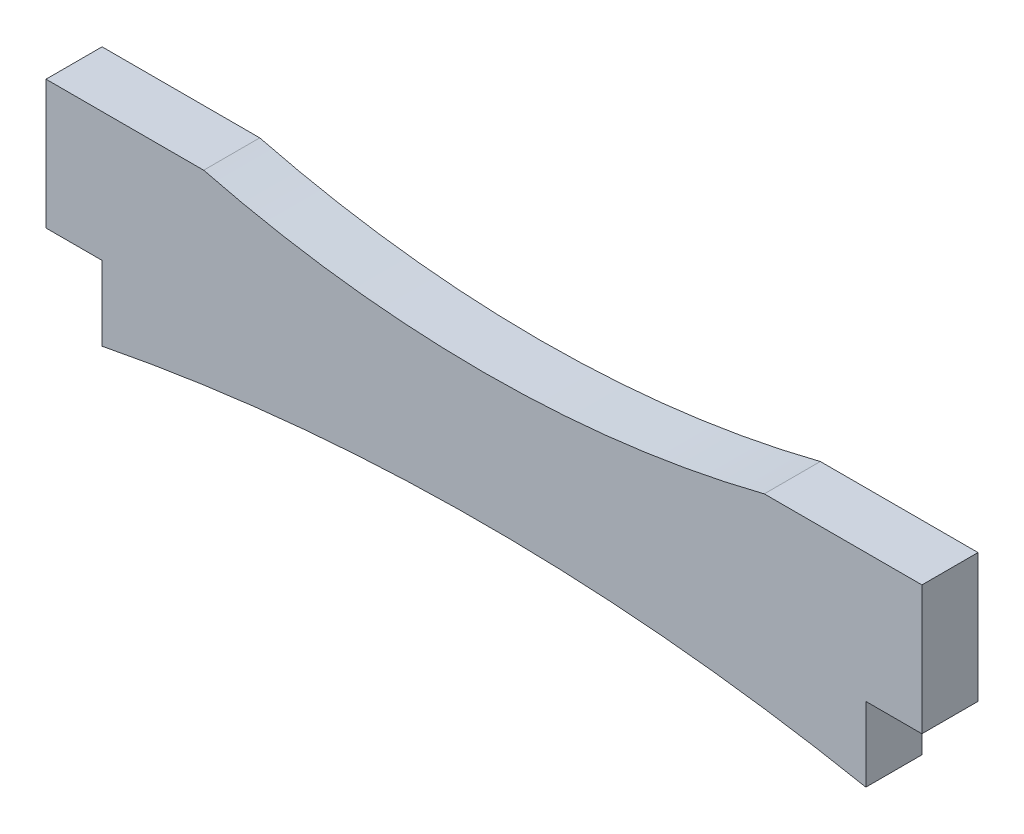
ISO-10303-21;
HEADER;
FILE_DESCRIPTION(('STEP AP214'),'2;1');
FILE_NAME('part.step','',(''),(''),'','','');
FILE_SCHEMA(('AUTOMOTIVE_DESIGN { 1 0 10303 214 1 1 1 1 }'));
ENDSEC;
DATA;
#1=APPLICATION_CONTEXT('core data for automotive mechanical design processes');
#2=APPLICATION_PROTOCOL_DEFINITION('international standard','automotive_design',2000,#1);
#3=PRODUCT_CONTEXT('',#1,'mechanical');
#4=PRODUCT('Part','Part','',(#3));
#5=PRODUCT_RELATED_PRODUCT_CATEGORY('part','',(#4));
#6=PRODUCT_DEFINITION_FORMATION('','',#4);
#7=PRODUCT_DEFINITION_CONTEXT('part definition',#1,'design');
#8=PRODUCT_DEFINITION('design','',#6,#7);
#9=PRODUCT_DEFINITION_SHAPE('','',#8);
#10=(LENGTH_UNIT() NAMED_UNIT(*) SI_UNIT(.MILLI.,.METRE.));
#11=(NAMED_UNIT(*) PLANE_ANGLE_UNIT() SI_UNIT($,.RADIAN.));
#12=(NAMED_UNIT(*) SI_UNIT($,.STERADIAN.) SOLID_ANGLE_UNIT());
#13=UNCERTAINTY_MEASURE_WITH_UNIT(LENGTH_MEASURE(1.E-05),#10,'distance_accuracy_value','');
#14=(GEOMETRIC_REPRESENTATION_CONTEXT(3) GLOBAL_UNCERTAINTY_ASSIGNED_CONTEXT((#13)) GLOBAL_UNIT_ASSIGNED_CONTEXT((#10,
#11,#12)) REPRESENTATION_CONTEXT('',''));
#15=CARTESIAN_POINT('',(0.,0.,0.));
#16=DIRECTION('',(0.,0.,1.));
#17=DIRECTION('',(1.,0.,0.));
#18=AXIS2_PLACEMENT_3D('',#15,#16,#17);
#19=CARTESIAN_POINT('',(-62.5,9.19905251205794,8.));
#20=DIRECTION('',(0.,-1.,0.));
#21=DIRECTION('',(0.,0.,-1.));
#22=AXIS2_PLACEMENT_3D('',#19,#20,#21);
#23=PLANE('',#22);
#24=DIRECTION('',(-1.,0.,0.));
#25=VECTOR('',#24,1.);
#26=CARTESIAN_POINT('',(-62.5,9.19905251205794,0.));
#27=LINE('',#26,#25);
#28=CARTESIAN_POINT('',(-40.,9.19905251205794,0.));
#29=VERTEX_POINT('',#28);
#30=CARTESIAN_POINT('',(-62.5,9.19905251205794,0.));
#31=VERTEX_POINT('',#30);
#32=EDGE_CURVE('E140',#29,#31,#27,.T.);
#33=ORIENTED_EDGE('',*,*,#32,.T.);
#34=DIRECTION('',(0.,0.,-1.));
#35=VECTOR('',#34,1.);
#36=CARTESIAN_POINT('',(-62.5,9.19905251205794,8.));
#37=LINE('',#36,#35);
#38=CARTESIAN_POINT('',(-62.5,9.19905251205794,8.));
#39=VERTEX_POINT('',#38);
#40=EDGE_CURVE('E11',#39,#31,#37,.T.);
#41=ORIENTED_EDGE('',*,*,#40,.F.);
#42=DIRECTION('',(-1.,0.,0.));
#43=VECTOR('',#42,1.);
#44=CARTESIAN_POINT('',(-62.5,9.19905251205794,8.));
#45=LINE('',#44,#43);
#46=CARTESIAN_POINT('',(-40.,9.19905251205794,8.));
#47=VERTEX_POINT('',#46);
#48=EDGE_CURVE('E158',#47,#39,#45,.T.);
#49=ORIENTED_EDGE('',*,*,#48,.F.);
#50=DIRECTION('',(0.,0.,-1.));
#51=VECTOR('',#50,1.);
#52=CARTESIAN_POINT('',(-40.,9.19905251205794,8.));
#53=LINE('',#52,#51);
#54=EDGE_CURVE('E136',#47,#29,#53,.T.);
#55=ORIENTED_EDGE('',*,*,#54,.T.);
#56=EDGE_LOOP('',(#33,#41,#49,#55));
#57=FACE_BOUND('',#56,.T.);
#58=ADVANCED_FACE('F32',(#57),#23,.F.);
#59=CARTESIAN_POINT('',(-62.5,9.19905251205794,8.));
#60=DIRECTION('',(1.,0.,0.));
#61=DIRECTION('',(0.,0.,-1.));
#62=AXIS2_PLACEMENT_3D('',#59,#60,#61);
#63=PLANE('',#62);
#64=DIRECTION('',(0.,-1.,0.));
#65=VECTOR('',#64,1.);
#66=CARTESIAN_POINT('',(-62.5,9.19905251205794,0.));
#67=LINE('',#66,#65);
#68=CARTESIAN_POINT('',(-62.5,-9.19905251205794,0.));
#69=VERTEX_POINT('',#68);
#70=EDGE_CURVE('E143',#31,#69,#67,.T.);
#71=ORIENTED_EDGE('',*,*,#70,.T.);
#72=DIRECTION('',(0.,0.,-1.));
#73=VECTOR('',#72,1.);
#74=CARTESIAN_POINT('',(-62.5,-9.19905251205794,8.));
#75=LINE('',#74,#73);
#76=CARTESIAN_POINT('',(-62.5,-9.19905251205794,8.));
#77=VERTEX_POINT('',#76);
#78=EDGE_CURVE('E40',#77,#69,#75,.T.);
#79=ORIENTED_EDGE('',*,*,#78,.F.);
#80=DIRECTION('',(0.,-1.,0.));
#81=VECTOR('',#80,1.);
#82=CARTESIAN_POINT('',(-62.5,9.19905251205794,8.));
#83=LINE('',#82,#81);
#84=EDGE_CURVE('E97',#39,#77,#83,.T.);
#85=ORIENTED_EDGE('',*,*,#84,.F.);
#86=ORIENTED_EDGE('',*,*,#40,.T.);
#87=EDGE_LOOP('',(#71,#79,#85,#86));
#88=FACE_BOUND('',#87,.T.);
#89=ADVANCED_FACE('F207',(#88),#63,.F.);
#90=CARTESIAN_POINT('',(-62.5,-9.19905251205794,8.));
#91=DIRECTION('',(0.,1.,0.));
#92=DIRECTION('',(0.,0.,1.));
#93=AXIS2_PLACEMENT_3D('',#90,#91,#92);
#94=PLANE('',#93);
#95=DIRECTION('',(1.,0.,0.));
#96=VECTOR('',#95,1.);
#97=CARTESIAN_POINT('',(-62.5,-9.19905251205794,0.));
#98=LINE('',#97,#96);
#99=CARTESIAN_POINT('',(-54.5,-9.19905251205794,0.));
#100=VERTEX_POINT('',#99);
#101=EDGE_CURVE('E145',#69,#100,#98,.T.);
#102=ORIENTED_EDGE('',*,*,#101,.T.);
#103=DIRECTION('',(0.,0.,-1.));
#104=VECTOR('',#103,1.);
#105=CARTESIAN_POINT('',(-54.5,-9.19905251205794,8.));
#106=LINE('',#105,#104);
#107=CARTESIAN_POINT('',(-54.5,-9.19905251205794,8.));
#108=VERTEX_POINT('',#107);
#109=EDGE_CURVE('E171',#108,#100,#106,.T.);
#110=ORIENTED_EDGE('',*,*,#109,.F.);
#111=DIRECTION('',(1.,0.,0.));
#112=VECTOR('',#111,1.);
#113=CARTESIAN_POINT('',(-62.5,-9.19905251205794,8.));
#114=LINE('',#113,#112);
#115=EDGE_CURVE('E179',#77,#108,#114,.T.);
#116=ORIENTED_EDGE('',*,*,#115,.F.);
#117=ORIENTED_EDGE('',*,*,#78,.T.);
#118=EDGE_LOOP('',(#102,#110,#116,#117));
#119=FACE_BOUND('',#118,.T.);
#120=ADVANCED_FACE('F177',(#119),#94,.F.);
#121=CARTESIAN_POINT('',(-54.5,-9.19905251205794,8.));
#122=DIRECTION('',(1.,0.,0.));
#123=DIRECTION('',(0.,0.,-1.));
#124=AXIS2_PLACEMENT_3D('',#121,#122,#123);
#125=PLANE('',#124);
#126=DIRECTION('',(0.,-1.,0.));
#127=VECTOR('',#126,1.);
#128=CARTESIAN_POINT('',(-54.5,-9.19905251205794,0.));
#129=LINE('',#128,#127);
#130=CARTESIAN_POINT('',(-54.5,-19.8009474879422,0.));
#131=VERTEX_POINT('',#130);
#132=EDGE_CURVE('E147',#100,#131,#129,.T.);
#133=ORIENTED_EDGE('',*,*,#132,.T.);
#134=DIRECTION('',(0.,0.,-1.));
#135=VECTOR('',#134,1.);
#136=CARTESIAN_POINT('',(-54.5,-19.8009474879422,8.));
#137=LINE('',#136,#135);
#138=CARTESIAN_POINT('',(-54.5,-19.8009474879422,8.));
#139=VERTEX_POINT('',#138);
#140=EDGE_CURVE('E168',#139,#131,#137,.T.);
#141=ORIENTED_EDGE('',*,*,#140,.F.);
#142=DIRECTION('',(0.,-1.,0.));
#143=VECTOR('',#142,1.);
#144=CARTESIAN_POINT('',(-54.5,-9.19905251205794,8.));
#145=LINE('',#144,#143);
#146=EDGE_CURVE('E197',#108,#139,#145,.T.);
#147=ORIENTED_EDGE('',*,*,#146,.F.);
#148=ORIENTED_EDGE('',*,*,#109,.T.);
#149=EDGE_LOOP('',(#133,#141,#147,#148));
#150=FACE_BOUND('',#149,.T.);
#151=ADVANCED_FACE('F188',(#150),#125,.F.);
#152=CARTESIAN_POINT('',(0.,-297.312652935175,8.));
#153=DIRECTION('',(0.,0.,-1.));
#154=DIRECTION('',(-1.,0.,0.));
#155=AXIS2_PLACEMENT_3D('',#152,#153,#154);
#156=CYLINDRICAL_SURFACE('',#155,282.812652935175);
#157=CARTESIAN_POINT('',(0.,-297.312652935175,0.));
#158=DIRECTION('',(0.,0.,-1.));
#159=DIRECTION('',(-1.,0.,0.));
#160=AXIS2_PLACEMENT_3D('',#157,#158,#159);
#161=CIRCLE('',#160,282.812652935175);
#162=CARTESIAN_POINT('',(54.5,-19.8009474879421,0.));
#163=VERTEX_POINT('',#162);
#164=EDGE_CURVE('E149',#131,#163,#161,.T.);
#165=ORIENTED_EDGE('',*,*,#164,.T.);
#166=DIRECTION('',(0.,0.,-1.));
#167=VECTOR('',#166,1.);
#168=CARTESIAN_POINT('',(54.5,-19.8009474879421,8.));
#169=LINE('',#168,#167);
#170=CARTESIAN_POINT('',(54.5,-19.8009474879421,8.));
#171=VERTEX_POINT('',#170);
#172=EDGE_CURVE('E165',#171,#163,#169,.T.);
#173=ORIENTED_EDGE('',*,*,#172,.F.);
#174=CARTESIAN_POINT('',(0.,-297.312652935175,8.));
#175=DIRECTION('',(0.,0.,-1.));
#176=DIRECTION('',(-1.,0.,0.));
#177=AXIS2_PLACEMENT_3D('',#174,#175,#176);
#178=CIRCLE('',#177,282.812652935175);
#179=EDGE_CURVE('E194',#139,#171,#178,.T.);
#180=ORIENTED_EDGE('',*,*,#179,.F.);
#181=ORIENTED_EDGE('',*,*,#140,.T.);
#182=EDGE_LOOP('',(#165,#173,#180,#181));
#183=FACE_BOUND('',#182,.T.);
#184=ADVANCED_FACE('F192',(#183),#156,.F.);
#185=CARTESIAN_POINT('',(54.5,-9.19905251205794,8.));
#186=DIRECTION('',(-1.,0.,0.));
#187=DIRECTION('',(0.,0.,1.));
#188=AXIS2_PLACEMENT_3D('',#185,#186,#187);
#189=PLANE('',#188);
#190=DIRECTION('',(0.,1.,0.));
#191=VECTOR('',#190,1.);
#192=CARTESIAN_POINT('',(54.5,-9.19905251205794,0.));
#193=LINE('',#192,#191);
#194=CARTESIAN_POINT('',(54.5,-9.19905251205794,0.));
#195=VERTEX_POINT('',#194);
#196=EDGE_CURVE('E151',#163,#195,#193,.T.);
#197=ORIENTED_EDGE('',*,*,#196,.T.);
#198=DIRECTION('',(0.,0.,-1.));
#199=VECTOR('',#198,1.);
#200=CARTESIAN_POINT('',(54.5,-9.19905251205794,8.));
#201=LINE('',#200,#199);
#202=CARTESIAN_POINT('',(54.5,-9.19905251205794,8.));
#203=VERTEX_POINT('',#202);
#204=EDGE_CURVE('E162',#203,#195,#201,.T.);
#205=ORIENTED_EDGE('',*,*,#204,.F.);
#206=DIRECTION('',(0.,1.,0.));
#207=VECTOR('',#206,1.);
#208=CARTESIAN_POINT('',(54.5,-9.19905251205794,8.));
#209=LINE('',#208,#207);
#210=EDGE_CURVE('E196',#171,#203,#209,.T.);
#211=ORIENTED_EDGE('',*,*,#210,.F.);
#212=ORIENTED_EDGE('',*,*,#172,.T.);
#213=EDGE_LOOP('',(#197,#205,#211,#212));
#214=FACE_BOUND('',#213,.T.);
#215=ADVANCED_FACE('F219',(#214),#189,.F.);
#216=CARTESIAN_POINT('',(62.5,-9.19905251205794,8.));
#217=DIRECTION('',(0.,1.,0.));
#218=DIRECTION('',(0.,0.,1.));
#219=AXIS2_PLACEMENT_3D('',#216,#217,#218);
#220=PLANE('',#219);
#221=DIRECTION('',(1.,0.,0.));
#222=VECTOR('',#221,1.);
#223=CARTESIAN_POINT('',(62.5,-9.19905251205794,0.));
#224=LINE('',#223,#222);
#225=CARTESIAN_POINT('',(62.5,-9.19905251205794,0.));
#226=VERTEX_POINT('',#225);
#227=EDGE_CURVE('E153',#195,#226,#224,.T.);
#228=ORIENTED_EDGE('',*,*,#227,.T.);
#229=DIRECTION('',(0.,0.,-1.));
#230=VECTOR('',#229,1.);
#231=CARTESIAN_POINT('',(62.5,-9.19905251205794,8.));
#232=LINE('',#231,#230);
#233=CARTESIAN_POINT('',(62.5,-9.19905251205794,8.));
#234=VERTEX_POINT('',#233);
#235=EDGE_CURVE('E131',#234,#226,#232,.T.);
#236=ORIENTED_EDGE('',*,*,#235,.F.);
#237=DIRECTION('',(1.,0.,0.));
#238=VECTOR('',#237,1.);
#239=CARTESIAN_POINT('',(62.5,-9.19905251205794,8.));
#240=LINE('',#239,#238);
#241=EDGE_CURVE('E122',#203,#234,#240,.T.);
#242=ORIENTED_EDGE('',*,*,#241,.F.);
#243=ORIENTED_EDGE('',*,*,#204,.T.);
#244=EDGE_LOOP('',(#228,#236,#242,#243));
#245=FACE_BOUND('',#244,.T.);
#246=ADVANCED_FACE('F222',(#245),#220,.F.);
#247=CARTESIAN_POINT('',(62.5,9.19905251205794,8.));
#248=DIRECTION('',(-1.,0.,0.));
#249=DIRECTION('',(0.,0.,1.));
#250=AXIS2_PLACEMENT_3D('',#247,#248,#249);
#251=PLANE('',#250);
#252=DIRECTION('',(0.,1.,0.));
#253=VECTOR('',#252,1.);
#254=CARTESIAN_POINT('',(62.5,9.19905251205794,0.));
#255=LINE('',#254,#253);
#256=CARTESIAN_POINT('',(62.5,9.19905251205794,0.));
#257=VERTEX_POINT('',#256);
#258=EDGE_CURVE('E130',#226,#257,#255,.T.);
#259=ORIENTED_EDGE('',*,*,#258,.T.);
#260=DIRECTION('',(0.,0.,-1.));
#261=VECTOR('',#260,1.);
#262=CARTESIAN_POINT('',(62.5,9.19905251205794,8.));
#263=LINE('',#262,#261);
#264=CARTESIAN_POINT('',(62.5,9.19905251205794,8.));
#265=VERTEX_POINT('',#264);
#266=EDGE_CURVE('E127',#265,#257,#263,.T.);
#267=ORIENTED_EDGE('',*,*,#266,.F.);
#268=DIRECTION('',(0.,1.,0.));
#269=VECTOR('',#268,1.);
#270=CARTESIAN_POINT('',(62.5,9.19905251205794,8.));
#271=LINE('',#270,#269);
#272=EDGE_CURVE('E116',#234,#265,#271,.T.);
#273=ORIENTED_EDGE('',*,*,#272,.F.);
#274=ORIENTED_EDGE('',*,*,#235,.T.);
#275=EDGE_LOOP('',(#259,#267,#273,#274));
#276=FACE_BOUND('',#275,.T.);
#277=ADVANCED_FACE('F128',(#276),#251,.F.);
#278=CARTESIAN_POINT('',(62.5,9.19905251205794,8.));
#279=DIRECTION('',(0.,-1.,0.));
#280=DIRECTION('',(1.,0.,0.));
#281=AXIS2_PLACEMENT_3D('',#278,#279,#280);
#282=PLANE('',#281);
#283=DIRECTION('',(-1.,0.,0.));
#284=VECTOR('',#283,1.);
#285=CARTESIAN_POINT('',(62.5,9.19905251205794,0.));
#286=LINE('',#285,#284);
#287=CARTESIAN_POINT('',(39.999990632369,9.19905251205794,0.));
#288=VERTEX_POINT('',#287);
#289=EDGE_CURVE('E83',#257,#288,#286,.T.);
#290=ORIENTED_EDGE('',*,*,#289,.T.);
#291=DIRECTION('',(0.,0.,-1.));
#292=VECTOR('',#291,1.);
#293=CARTESIAN_POINT('',(39.999990632369,9.19905251205794,8.));
#294=LINE('',#293,#292);
#295=CARTESIAN_POINT('',(39.999990632369,9.19905251205794,8.));
#296=VERTEX_POINT('',#295);
#297=EDGE_CURVE('E132',#296,#288,#294,.T.);
#298=ORIENTED_EDGE('',*,*,#297,.F.);
#299=DIRECTION('',(-1.,0.,0.));
#300=VECTOR('',#299,1.);
#301=CARTESIAN_POINT('',(62.5,9.19905251205794,8.));
#302=LINE('',#301,#300);
#303=EDGE_CURVE('E120',#265,#296,#302,.T.);
#304=ORIENTED_EDGE('',*,*,#303,.F.);
#305=ORIENTED_EDGE('',*,*,#266,.T.);
#306=EDGE_LOOP('',(#290,#298,#304,#305));
#307=FACE_BOUND('',#306,.T.);
#308=ADVANCED_FACE('F134',(#307),#282,.F.);
#309=CARTESIAN_POINT('',(-4.68381546742114E-06,166.699015041536,8.));
#310=DIRECTION('',(0.,0.,-1.));
#311=DIRECTION('',(-1.,0.,0.));
#312=AXIS2_PLACEMENT_3D('',#309,#310,#311);
#313=CYLINDRICAL_SURFACE('',#312,162.499962529479);
#314=CARTESIAN_POINT('',(-4.68381546742114E-06,166.699015041536,0.));
#315=DIRECTION('',(0.,0.,-1.));
#316=DIRECTION('',(1.,0.,0.));
#317=AXIS2_PLACEMENT_3D('',#314,#315,#316);
#318=CIRCLE('',#317,162.499962529479);
#319=EDGE_CURVE('E89',#288,#29,#318,.T.);
#320=ORIENTED_EDGE('',*,*,#319,.T.);
#321=ORIENTED_EDGE('',*,*,#54,.F.);
#322=CARTESIAN_POINT('',(-4.68381546742114E-06,166.699015041536,8.));
#323=DIRECTION('',(0.,0.,-1.));
#324=DIRECTION('',(1.,0.,0.));
#325=AXIS2_PLACEMENT_3D('',#322,#323,#324);
#326=CIRCLE('',#325,162.499962529479);
#327=EDGE_CURVE('E48',#296,#47,#326,.T.);
#328=ORIENTED_EDGE('',*,*,#327,.F.);
#329=ORIENTED_EDGE('',*,*,#297,.T.);
#330=EDGE_LOOP('',(#320,#321,#328,#329));
#331=FACE_BOUND('',#330,.T.);
#332=ADVANCED_FACE('F231',(#331),#313,.F.);
#333=CARTESIAN_POINT('',(-4.68381546742114E-06,166.699015041536,8.));
#334=DIRECTION('',(0.,0.,1.));
#335=DIRECTION('',(1.,0.,0.));
#336=AXIS2_PLACEMENT_3D('',#333,#334,#335);
#337=PLANE('',#336);
#338=ORIENTED_EDGE('',*,*,#48,.T.);
#339=ORIENTED_EDGE('',*,*,#84,.T.);
#340=ORIENTED_EDGE('',*,*,#115,.T.);
#341=ORIENTED_EDGE('',*,*,#146,.T.);
#342=ORIENTED_EDGE('',*,*,#179,.T.);
#343=ORIENTED_EDGE('',*,*,#210,.T.);
#344=ORIENTED_EDGE('',*,*,#241,.T.);
#345=ORIENTED_EDGE('',*,*,#272,.T.);
#346=ORIENTED_EDGE('',*,*,#303,.T.);
#347=ORIENTED_EDGE('',*,*,#327,.T.);
#348=EDGE_LOOP('',(#338,#339,#340,#341,#342,#343,#344,#345,#346,#347));
#349=FACE_BOUND('',#348,.T.);
#350=ADVANCED_FACE('F118',(#349),#337,.T.);
#351=CARTESIAN_POINT('',(-4.68381546742114E-06,166.699015041536,0.));
#352=DIRECTION('',(0.,0.,1.));
#353=DIRECTION('',(1.,0.,0.));
#354=AXIS2_PLACEMENT_3D('',#351,#352,#353);
#355=PLANE('',#354);
#356=ORIENTED_EDGE('',*,*,#32,.F.);
#357=ORIENTED_EDGE('',*,*,#319,.F.);
#358=ORIENTED_EDGE('',*,*,#289,.F.);
#359=ORIENTED_EDGE('',*,*,#258,.F.);
#360=ORIENTED_EDGE('',*,*,#227,.F.);
#361=ORIENTED_EDGE('',*,*,#196,.F.);
#362=ORIENTED_EDGE('',*,*,#164,.F.);
#363=ORIENTED_EDGE('',*,*,#132,.F.);
#364=ORIENTED_EDGE('',*,*,#101,.F.);
#365=ORIENTED_EDGE('',*,*,#70,.F.);
#366=EDGE_LOOP('',(#356,#357,#358,#359,#360,#361,#362,#363,#364,#365));
#367=FACE_BOUND('',#366,.T.);
#368=ADVANCED_FACE('F183',(#367),#355,.F.);
#369=CLOSED_SHELL('',(#58,#89,#120,#151,#184,#215,#246,#277,#308,#332,#350,#368));
#370=MANIFOLD_SOLID_BREP('B2',#369);
#371=ADVANCED_BREP_SHAPE_REPRESENTATION('',(#18,#370),#14);
#372=SHAPE_DEFINITION_REPRESENTATION(#9,#371);
ENDSEC;
END-ISO-10303-21;
